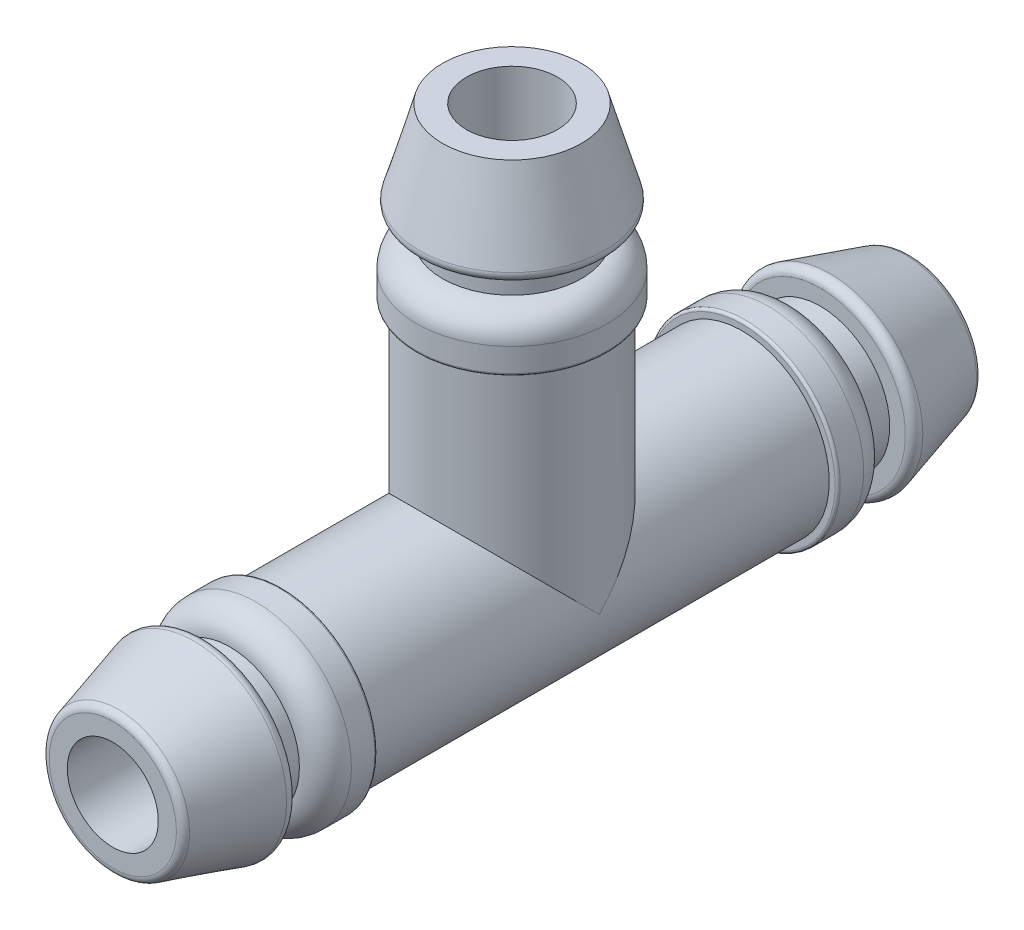
ISO-10303-21;
HEADER;
FILE_DESCRIPTION(('STEP AP214'),'2;1');
FILE_NAME('part.step','',(''),(''),'','','');
FILE_SCHEMA(('AUTOMOTIVE_DESIGN { 1 0 10303 214 1 1 1 1 }'));
ENDSEC;
DATA;
#1=APPLICATION_CONTEXT('core data for automotive mechanical design processes');
#2=APPLICATION_PROTOCOL_DEFINITION('international standard','automotive_design',2000,#1);
#3=PRODUCT_CONTEXT('',#1,'mechanical');
#4=PRODUCT('Part','Part','',(#3));
#5=PRODUCT_RELATED_PRODUCT_CATEGORY('part','',(#4));
#6=PRODUCT_DEFINITION_FORMATION('','',#4);
#7=PRODUCT_DEFINITION_CONTEXT('part definition',#1,'design');
#8=PRODUCT_DEFINITION('design','',#6,#7);
#9=PRODUCT_DEFINITION_SHAPE('','',#8);
#10=(LENGTH_UNIT() NAMED_UNIT(*) SI_UNIT(.MILLI.,.METRE.));
#11=(NAMED_UNIT(*) PLANE_ANGLE_UNIT() SI_UNIT($,.RADIAN.));
#12=(NAMED_UNIT(*) SI_UNIT($,.STERADIAN.) SOLID_ANGLE_UNIT());
#13=UNCERTAINTY_MEASURE_WITH_UNIT(LENGTH_MEASURE(1.E-05),#10,'distance_accuracy_value','');
#14=(GEOMETRIC_REPRESENTATION_CONTEXT(3) GLOBAL_UNCERTAINTY_ASSIGNED_CONTEXT((#13)) GLOBAL_UNIT_ASSIGNED_CONTEXT((#10,
#11,#12)) REPRESENTATION_CONTEXT('',''));
#15=CARTESIAN_POINT('',(0.,0.,0.));
#16=DIRECTION('',(0.,0.,1.));
#17=DIRECTION('',(1.,0.,0.));
#18=AXIS2_PLACEMENT_3D('',#15,#16,#17);
#19=CARTESIAN_POINT('',(0.,0.,-8.85));
#20=DIRECTION('',(0.,0.,1.));
#21=DIRECTION('',(1.,0.,0.));
#22=AXIS2_PLACEMENT_3D('',#19,#20,#21);
#23=CYLINDRICAL_SURFACE('',#22,3.35);
#24=CARTESIAN_POINT('',(0.,0.,-8.85));
#25=DIRECTION('',(0.,0.,1.));
#26=DIRECTION('',(1.,0.,0.));
#27=AXIS2_PLACEMENT_3D('',#24,#25,#26);
#28=CIRCLE('',#27,3.35);
#29=CARTESIAN_POINT('',(3.35,0.,-8.85));
#30=VERTEX_POINT('',#29);
#31=EDGE_CURVE('E104',#30,#30,#28,.T.);
#32=ORIENTED_EDGE('',*,*,#31,.T.);
#33=EDGE_LOOP('',(#32));
#34=FACE_BOUND('',#33,.T.);
#35=CARTESIAN_POINT('',(0.,0.,8.85));
#36=DIRECTION('',(0.,0.,1.));
#37=DIRECTION('',(1.,0.,0.));
#38=AXIS2_PLACEMENT_3D('',#35,#36,#37);
#39=CIRCLE('',#38,3.35);
#40=CARTESIAN_POINT('',(3.35,0.,8.85));
#41=VERTEX_POINT('',#40);
#42=EDGE_CURVE('E109',#41,#41,#39,.T.);
#43=ORIENTED_EDGE('',*,*,#42,.F.);
#44=EDGE_LOOP('',(#43));
#45=FACE_BOUND('',#44,.T.);
#46=CARTESIAN_POINT('',(0.,0.,0.));
#47=DIRECTION('',(0.,0.707106781186547,0.707106781186547));
#48=DIRECTION('',(0.,-0.707106781186547,0.707106781186547));
#49=AXIS2_PLACEMENT_3D('',#46,#47,#48);
#50=ELLIPSE('',#49,4.73761543394987,3.35);
#51=CARTESIAN_POINT('',(-3.35,0.,0.));
#52=VERTEX_POINT('',#51);
#53=CARTESIAN_POINT('',(3.35,0.,0.));
#54=VERTEX_POINT('',#53);
#55=EDGE_CURVE('E180',#52,#54,#50,.F.);
#56=ORIENTED_EDGE('',*,*,#55,.T.);
#57=CARTESIAN_POINT('',(0.,0.,0.));
#58=DIRECTION('',(0.,-0.707106781186547,0.707106781186547));
#59=DIRECTION('',(0.,0.707106781186547,0.707106781186547));
#60=AXIS2_PLACEMENT_3D('',#57,#58,#59);
#61=ELLIPSE('',#60,4.73761543394987,3.35);
#62=EDGE_CURVE('E61',#54,#52,#61,.T.);
#63=ORIENTED_EDGE('',*,*,#62,.T.);
#64=EDGE_LOOP('',(#56,#63));
#65=FACE_BOUND('',#64,.T.);
#66=ADVANCED_FACE('F39',(#34,#45,#65),#23,.T.);
#67=CARTESIAN_POINT('',(0.,0.,10.85));
#68=DIRECTION('',(0.,0.,-1.));
#69=DIRECTION('',(-1.,0.,0.));
#70=AXIS2_PLACEMENT_3D('',#67,#68,#69);
#71=CYLINDRICAL_SURFACE('',#70,3.675);
#72=CARTESIAN_POINT('',(0.,0.,8.95));
#73=DIRECTION('',(0.,0.,1.));
#74=DIRECTION('',(1.,0.,0.));
#75=AXIS2_PLACEMENT_3D('',#72,#73,#74);
#76=CIRCLE('',#75,3.675);
#77=CARTESIAN_POINT('',(3.675,0.,8.95));
#78=VERTEX_POINT('',#77);
#79=EDGE_CURVE('E140',#78,#78,#76,.T.);
#80=ORIENTED_EDGE('',*,*,#79,.T.);
#81=EDGE_LOOP('',(#80));
#82=FACE_BOUND('',#81,.T.);
#83=CARTESIAN_POINT('',(0.,0.,9.85));
#84=DIRECTION('',(0.,0.,1.));
#85=DIRECTION('',(1.,0.,0.));
#86=AXIS2_PLACEMENT_3D('',#83,#84,#85);
#87=CIRCLE('',#86,3.675);
#88=CARTESIAN_POINT('',(3.675,0.,9.85));
#89=VERTEX_POINT('',#88);
#90=EDGE_CURVE('E120',#89,#89,#87,.F.);
#91=ORIENTED_EDGE('',*,*,#90,.T.);
#92=EDGE_LOOP('',(#91));
#93=FACE_BOUND('',#92,.T.);
#94=ADVANCED_FACE('F216',(#82,#93),#71,.T.);
#95=CARTESIAN_POINT('',(0.,0.,8.85));
#96=DIRECTION('',(0.,0.,1.));
#97=DIRECTION('',(1.,0.,0.));
#98=AXIS2_PLACEMENT_3D('',#95,#96,#97);
#99=PLANE('',#98);
#100=CARTESIAN_POINT('',(0.,0.,8.85));
#101=DIRECTION('',(0.,0.,1.));
#102=DIRECTION('',(1.,0.,0.));
#103=AXIS2_PLACEMENT_3D('',#100,#101,#102);
#104=CIRCLE('',#103,3.575);
#105=CARTESIAN_POINT('',(3.575,0.,8.85));
#106=VERTEX_POINT('',#105);
#107=EDGE_CURVE('E144',#106,#106,#104,.F.);
#108=ORIENTED_EDGE('',*,*,#107,.T.);
#109=EDGE_LOOP('',(#108));
#110=FACE_BOUND('',#109,.T.);
#111=ORIENTED_EDGE('',*,*,#42,.T.);
#112=EDGE_LOOP('',(#111));
#113=FACE_BOUND('',#112,.T.);
#114=ADVANCED_FACE('F222',(#110,#113),#99,.F.);
#115=CARTESIAN_POINT('',(0.,0.,9.85));
#116=DIRECTION('',(0.,0.,1.));
#117=DIRECTION('',(1.,0.,0.));
#118=AXIS2_PLACEMENT_3D('',#115,#116,#117);
#119=TOROIDAL_SURFACE('',#118,2.675,1.);
#120=ORIENTED_EDGE('',*,*,#90,.F.);
#121=EDGE_LOOP('',(#120));
#122=FACE_BOUND('',#121,.T.);
#123=CARTESIAN_POINT('',(0.,0.,10.85));
#124=DIRECTION('',(0.,0.,1.));
#125=DIRECTION('',(1.,0.,0.));
#126=AXIS2_PLACEMENT_3D('',#123,#124,#125);
#127=CIRCLE('',#126,2.675);
#128=CARTESIAN_POINT('',(2.675,0.,10.85));
#129=VERTEX_POINT('',#128);
#130=EDGE_CURVE('E113',#129,#129,#127,.T.);
#131=ORIENTED_EDGE('',*,*,#130,.F.);
#132=EDGE_LOOP('',(#131));
#133=FACE_BOUND('',#132,.T.);
#134=ADVANCED_FACE('F228',(#122,#133),#119,.T.);
#135=CARTESIAN_POINT('',(0.,0.,11.85));
#136=DIRECTION('',(0.,0.,-1.));
#137=DIRECTION('',(-1.,0.,0.));
#138=AXIS2_PLACEMENT_3D('',#135,#136,#137);
#139=CYLINDRICAL_SURFACE('',#138,2.675);
#140=CARTESIAN_POINT('',(0.,0.,11.85));
#141=DIRECTION('',(0.,0.,1.));
#142=DIRECTION('',(1.,0.,0.));
#143=AXIS2_PLACEMENT_3D('',#140,#141,#142);
#144=CIRCLE('',#143,2.675);
#145=CARTESIAN_POINT('',(2.675,0.,11.85));
#146=VERTEX_POINT('',#145);
#147=EDGE_CURVE('E105',#146,#146,#144,.T.);
#148=ORIENTED_EDGE('',*,*,#147,.F.);
#149=EDGE_LOOP('',(#148));
#150=FACE_BOUND('',#149,.T.);
#151=ORIENTED_EDGE('',*,*,#130,.T.);
#152=EDGE_LOOP('',(#151));
#153=FACE_BOUND('',#152,.T.);
#154=ADVANCED_FACE('F231',(#150,#153),#139,.T.);
#155=CARTESIAN_POINT('',(0.,0.,11.85));
#156=DIRECTION('',(0.,0.,-1.));
#157=DIRECTION('',(1.,0.,0.));
#158=AXIS2_PLACEMENT_3D('',#155,#156,#157);
#159=CONICAL_SURFACE('',#158,3.675,0.279252680319093);
#160=CARTESIAN_POINT('',(0.,0.,12.2326912067451));
#161=DIRECTION('',(0.,0.,1.));
#162=DIRECTION('',(1.,0.,0.));
#163=AXIS2_PLACEMENT_3D('',#160,#161,#162);
#164=CIRCLE('',#163,3.56526506229537);
#165=CARTESIAN_POINT('',(3.56526506229537,0.,12.2326912067451));
#166=VERTEX_POINT('',#165);
#167=EDGE_CURVE('E128',#166,#166,#164,.T.);
#168=ORIENTED_EDGE('',*,*,#167,.T.);
#169=EDGE_LOOP('',(#168));
#170=FACE_BOUND('',#169,.T.);
#171=CARTESIAN_POINT('',(0.,0.,15.1326912067451));
#172=DIRECTION('',(0.,0.,-1.));
#173=DIRECTION('',(-1.,0.,0.));
#174=AXIS2_PLACEMENT_3D('',#171,#172,#173);
#175=CIRCLE('',#174,2.73370344359483);
#176=CARTESIAN_POINT('',(-2.73370344359483,0.,15.1326912067451));
#177=VERTEX_POINT('',#176);
#178=EDGE_CURVE('E124',#177,#177,#175,.T.);
#179=ORIENTED_EDGE('',*,*,#178,.T.);
#180=EDGE_LOOP('',(#179));
#181=FACE_BOUND('',#180,.T.);
#182=ADVANCED_FACE('F317',(#170,#181),#159,.T.);
#183=CARTESIAN_POINT('',(0.,0.,15.35));
#184=DIRECTION('',(0.,0.,1.));
#185=DIRECTION('',(1.,0.,0.));
#186=AXIS2_PLACEMENT_3D('',#183,#184,#185);
#187=PLANE('',#186);
#188=CARTESIAN_POINT('',(0.,0.,15.35));
#189=DIRECTION('',(0.,0.,-1.));
#190=DIRECTION('',(-1.,0.,0.));
#191=AXIS2_PLACEMENT_3D('',#188,#189,#190);
#192=CIRCLE('',#191,1.75);
#193=CARTESIAN_POINT('',(-1.75,0.,15.35));
#194=VERTEX_POINT('',#193);
#195=EDGE_CURVE('E89',#194,#194,#192,.T.);
#196=ORIENTED_EDGE('',*,*,#195,.T.);
#197=EDGE_LOOP('',(#196));
#198=FACE_BOUND('',#197,.T.);
#199=CARTESIAN_POINT('',(0.,0.,15.35));
#200=DIRECTION('',(0.,0.,1.));
#201=DIRECTION('',(1.,0.,0.));
#202=AXIS2_PLACEMENT_3D('',#199,#200,#201);
#203=CIRCLE('',#202,2.44532493481333);
#204=CARTESIAN_POINT('',(2.44532493481333,0.,15.35));
#205=VERTEX_POINT('',#204);
#206=EDGE_CURVE('E136',#205,#205,#203,.T.);
#207=ORIENTED_EDGE('',*,*,#206,.T.);
#208=EDGE_LOOP('',(#207));
#209=FACE_BOUND('',#208,.T.);
#210=ADVANCED_FACE('F314',(#198,#209),#187,.T.);
#211=CARTESIAN_POINT('',(0.,0.,11.85));
#212=DIRECTION('',(0.,0.,1.));
#213=DIRECTION('',(1.,0.,0.));
#214=AXIS2_PLACEMENT_3D('',#211,#212,#213);
#215=PLANE('',#214);
#216=CARTESIAN_POINT('',(0.,0.,11.85));
#217=DIRECTION('',(0.,0.,1.));
#218=DIRECTION('',(1.,0.,0.));
#219=AXIS2_PLACEMENT_3D('',#216,#217,#218);
#220=CIRCLE('',#219,3.27688655351388);
#221=CARTESIAN_POINT('',(3.27688655351388,0.,11.85));
#222=VERTEX_POINT('',#221);
#223=EDGE_CURVE('E132',#222,#222,#220,.F.);
#224=ORIENTED_EDGE('',*,*,#223,.T.);
#225=EDGE_LOOP('',(#224));
#226=FACE_BOUND('',#225,.T.);
#227=ORIENTED_EDGE('',*,*,#147,.T.);
#228=EDGE_LOOP('',(#227));
#229=FACE_BOUND('',#228,.T.);
#230=ADVANCED_FACE('F237',(#226,#229),#215,.F.);
#231=CARTESIAN_POINT('',(0.,0.,12.15));
#232=DIRECTION('',(0.,0.,1.));
#233=DIRECTION('',(1.,0.,0.));
#234=AXIS2_PLACEMENT_3D('',#231,#232,#233);
#235=TOROIDAL_SURFACE('',#234,3.27688655351388,0.3);
#236=ORIENTED_EDGE('',*,*,#223,.F.);
#237=EDGE_LOOP('',(#236));
#238=FACE_BOUND('',#237,.T.);
#239=ORIENTED_EDGE('',*,*,#167,.F.);
#240=EDGE_LOOP('',(#239));
#241=FACE_BOUND('',#240,.T.);
#242=ADVANCED_FACE('F233',(#238,#241),#235,.T.);
#243=CARTESIAN_POINT('',(0.,0.,15.05));
#244=DIRECTION('',(0.,0.,1.));
#245=DIRECTION('',(1.,0.,0.));
#246=AXIS2_PLACEMENT_3D('',#243,#244,#245);
#247=TOROIDAL_SURFACE('',#246,2.44532493481333,0.3);
#248=ORIENTED_EDGE('',*,*,#178,.F.);
#249=EDGE_LOOP('',(#248));
#250=FACE_BOUND('',#249,.T.);
#251=ORIENTED_EDGE('',*,*,#206,.F.);
#252=EDGE_LOOP('',(#251));
#253=FACE_BOUND('',#252,.T.);
#254=ADVANCED_FACE('F236',(#250,#253),#247,.T.);
#255=CARTESIAN_POINT('',(0.,0.,8.95));
#256=DIRECTION('',(0.,0.,1.));
#257=DIRECTION('',(1.,0.,0.));
#258=AXIS2_PLACEMENT_3D('',#255,#256,#257);
#259=TOROIDAL_SURFACE('',#258,3.575,0.1);
#260=ORIENTED_EDGE('',*,*,#107,.F.);
#261=EDGE_LOOP('',(#260));
#262=FACE_BOUND('',#261,.T.);
#263=ORIENTED_EDGE('',*,*,#79,.F.);
#264=EDGE_LOOP('',(#263));
#265=FACE_BOUND('',#264,.T.);
#266=ADVANCED_FACE('F241',(#262,#265),#259,.T.);
#267=CARTESIAN_POINT('',(0.,0.,-10.85));
#268=DIRECTION('',(0.,0.,1.));
#269=DIRECTION('',(1.,0.,0.));
#270=AXIS2_PLACEMENT_3D('',#267,#268,#269);
#271=CYLINDRICAL_SURFACE('',#270,3.675);
#272=CARTESIAN_POINT('',(0.,0.,-8.95));
#273=DIRECTION('',(0.,0.,-1.));
#274=DIRECTION('',(-1.,0.,0.));
#275=AXIS2_PLACEMENT_3D('',#272,#273,#274);
#276=CIRCLE('',#275,3.675);
#277=CARTESIAN_POINT('',(-3.675,0.,-8.95));
#278=VERTEX_POINT('',#277);
#279=EDGE_CURVE('E176',#278,#278,#276,.T.);
#280=ORIENTED_EDGE('',*,*,#279,.T.);
#281=EDGE_LOOP('',(#280));
#282=FACE_BOUND('',#281,.T.);
#283=CARTESIAN_POINT('',(0.,0.,-9.85));
#284=DIRECTION('',(0.,0.,-1.));
#285=DIRECTION('',(-1.,0.,0.));
#286=AXIS2_PLACEMENT_3D('',#283,#284,#285);
#287=CIRCLE('',#286,3.675);
#288=CARTESIAN_POINT('',(-3.675,0.,-9.85));
#289=VERTEX_POINT('',#288);
#290=EDGE_CURVE('E148',#289,#289,#287,.F.);
#291=ORIENTED_EDGE('',*,*,#290,.T.);
#292=EDGE_LOOP('',(#291));
#293=FACE_BOUND('',#292,.T.);
#294=ADVANCED_FACE('F245',(#282,#293),#271,.T.);
#295=CARTESIAN_POINT('',(0.,0.,-8.85));
#296=DIRECTION('',(0.,0.,-1.));
#297=DIRECTION('',(1.,0.,0.));
#298=AXIS2_PLACEMENT_3D('',#295,#296,#297);
#299=PLANE('',#298);
#300=CARTESIAN_POINT('',(0.,0.,-8.85));
#301=DIRECTION('',(0.,0.,-1.));
#302=DIRECTION('',(-1.,0.,0.));
#303=AXIS2_PLACEMENT_3D('',#300,#301,#302);
#304=CIRCLE('',#303,3.575);
#305=CARTESIAN_POINT('',(-3.575,0.,-8.85));
#306=VERTEX_POINT('',#305);
#307=EDGE_CURVE('E172',#306,#306,#304,.F.);
#308=ORIENTED_EDGE('',*,*,#307,.T.);
#309=EDGE_LOOP('',(#308));
#310=FACE_BOUND('',#309,.T.);
#311=ORIENTED_EDGE('',*,*,#31,.F.);
#312=EDGE_LOOP('',(#311));
#313=FACE_BOUND('',#312,.T.);
#314=ADVANCED_FACE('F251',(#310,#313),#299,.F.);
#315=CARTESIAN_POINT('',(0.,0.,-9.85));
#316=DIRECTION('',(0.,0.,-1.));
#317=DIRECTION('',(-1.,0.,0.));
#318=AXIS2_PLACEMENT_3D('',#315,#316,#317);
#319=TOROIDAL_SURFACE('',#318,2.675,1.);
#320=CARTESIAN_POINT('',(0.,0.,-10.85));
#321=DIRECTION('',(0.,0.,-1.));
#322=DIRECTION('',(-1.,0.,0.));
#323=AXIS2_PLACEMENT_3D('',#320,#321,#322);
#324=CIRCLE('',#323,2.675);
#325=CARTESIAN_POINT('',(-2.675,0.,-10.85));
#326=VERTEX_POINT('',#325);
#327=EDGE_CURVE('E152',#326,#326,#324,.T.);
#328=ORIENTED_EDGE('',*,*,#327,.F.);
#329=EDGE_LOOP('',(#328));
#330=FACE_BOUND('',#329,.T.);
#331=ORIENTED_EDGE('',*,*,#290,.F.);
#332=EDGE_LOOP('',(#331));
#333=FACE_BOUND('',#332,.T.);
#334=ADVANCED_FACE('F247',(#330,#333),#319,.T.);
#335=CARTESIAN_POINT('',(0.,0.,-11.85));
#336=DIRECTION('',(0.,0.,1.));
#337=DIRECTION('',(1.,0.,0.));
#338=AXIS2_PLACEMENT_3D('',#335,#336,#337);
#339=CYLINDRICAL_SURFACE('',#338,2.675);
#340=CARTESIAN_POINT('',(0.,0.,-11.85));
#341=DIRECTION('',(0.,0.,1.));
#342=DIRECTION('',(1.,0.,0.));
#343=AXIS2_PLACEMENT_3D('',#340,#341,#342);
#344=CIRCLE('',#343,2.675);
#345=CARTESIAN_POINT('',(2.675,0.,-11.85));
#346=VERTEX_POINT('',#345);
#347=EDGE_CURVE('E100',#346,#346,#344,.T.);
#348=ORIENTED_EDGE('',*,*,#347,.T.);
#349=EDGE_LOOP('',(#348));
#350=FACE_BOUND('',#349,.T.);
#351=ORIENTED_EDGE('',*,*,#327,.T.);
#352=EDGE_LOOP('',(#351));
#353=FACE_BOUND('',#352,.T.);
#354=ADVANCED_FACE('F250',(#350,#353),#339,.T.);
#355=CARTESIAN_POINT('',(0.,0.,-11.85));
#356=DIRECTION('',(0.,0.,1.));
#357=DIRECTION('',(1.,0.,0.));
#358=AXIS2_PLACEMENT_3D('',#355,#356,#357);
#359=CONICAL_SURFACE('',#358,3.675,0.279252680319093);
#360=CARTESIAN_POINT('',(0.,0.,-12.2326912067451));
#361=DIRECTION('',(0.,0.,1.));
#362=DIRECTION('',(1.,0.,0.));
#363=AXIS2_PLACEMENT_3D('',#360,#361,#362);
#364=CIRCLE('',#363,3.56526506229537);
#365=CARTESIAN_POINT('',(3.56526506229537,0.,-12.2326912067451));
#366=VERTEX_POINT('',#365);
#367=EDGE_CURVE('E164',#366,#366,#364,.F.);
#368=ORIENTED_EDGE('',*,*,#367,.T.);
#369=EDGE_LOOP('',(#368));
#370=FACE_BOUND('',#369,.T.);
#371=CARTESIAN_POINT('',(0.,0.,-15.1326912067451));
#372=DIRECTION('',(0.,0.,-1.));
#373=DIRECTION('',(-1.,0.,0.));
#374=AXIS2_PLACEMENT_3D('',#371,#372,#373);
#375=CIRCLE('',#374,2.73370344359483);
#376=CARTESIAN_POINT('',(-2.73370344359483,0.,-15.1326912067451));
#377=VERTEX_POINT('',#376);
#378=EDGE_CURVE('E160',#377,#377,#375,.F.);
#379=ORIENTED_EDGE('',*,*,#378,.T.);
#380=EDGE_LOOP('',(#379));
#381=FACE_BOUND('',#380,.T.);
#382=ADVANCED_FACE('F297',(#370,#381),#359,.T.);
#383=CARTESIAN_POINT('',(0.,0.,-15.35));
#384=DIRECTION('',(0.,0.,-1.));
#385=DIRECTION('',(1.,0.,0.));
#386=AXIS2_PLACEMENT_3D('',#383,#384,#385);
#387=PLANE('',#386);
#388=CARTESIAN_POINT('',(0.,0.,-15.35));
#389=DIRECTION('',(0.,0.,-1.));
#390=DIRECTION('',(-1.,0.,0.));
#391=AXIS2_PLACEMENT_3D('',#388,#389,#390);
#392=CIRCLE('',#391,1.75);
#393=CARTESIAN_POINT('',(-1.75,0.,-15.35));
#394=VERTEX_POINT('',#393);
#395=EDGE_CURVE('E88',#394,#394,#392,.T.);
#396=ORIENTED_EDGE('',*,*,#395,.F.);
#397=EDGE_LOOP('',(#396));
#398=FACE_BOUND('',#397,.T.);
#399=CARTESIAN_POINT('',(0.,0.,-15.35));
#400=DIRECTION('',(0.,0.,-1.));
#401=DIRECTION('',(-1.,0.,0.));
#402=AXIS2_PLACEMENT_3D('',#399,#400,#401);
#403=CIRCLE('',#402,2.44532493481333);
#404=CARTESIAN_POINT('',(-2.44532493481333,0.,-15.35));
#405=VERTEX_POINT('',#404);
#406=EDGE_CURVE('E168',#405,#405,#403,.T.);
#407=ORIENTED_EDGE('',*,*,#406,.T.);
#408=EDGE_LOOP('',(#407));
#409=FACE_BOUND('',#408,.T.);
#410=ADVANCED_FACE('F294',(#398,#409),#387,.T.);
#411=CARTESIAN_POINT('',(0.,0.,-11.85));
#412=DIRECTION('',(0.,0.,-1.));
#413=DIRECTION('',(1.,0.,0.));
#414=AXIS2_PLACEMENT_3D('',#411,#412,#413);
#415=PLANE('',#414);
#416=CARTESIAN_POINT('',(0.,0.,-11.85));
#417=DIRECTION('',(0.,0.,-1.));
#418=DIRECTION('',(-1.,0.,0.));
#419=AXIS2_PLACEMENT_3D('',#416,#417,#418);
#420=CIRCLE('',#419,3.27688655351388);
#421=CARTESIAN_POINT('',(-3.27688655351388,0.,-11.85));
#422=VERTEX_POINT('',#421);
#423=EDGE_CURVE('E156',#422,#422,#420,.F.);
#424=ORIENTED_EDGE('',*,*,#423,.T.);
#425=EDGE_LOOP('',(#424));
#426=FACE_BOUND('',#425,.T.);
#427=ORIENTED_EDGE('',*,*,#347,.F.);
#428=EDGE_LOOP('',(#427));
#429=FACE_BOUND('',#428,.T.);
#430=ADVANCED_FACE('F257',(#426,#429),#415,.F.);
#431=CARTESIAN_POINT('',(0.,0.,-12.15));
#432=DIRECTION('',(0.,0.,-1.));
#433=DIRECTION('',(-1.,0.,0.));
#434=AXIS2_PLACEMENT_3D('',#431,#432,#433);
#435=TOROIDAL_SURFACE('',#434,3.27688655351388,0.3);
#436=ORIENTED_EDGE('',*,*,#367,.F.);
#437=EDGE_LOOP('',(#436));
#438=FACE_BOUND('',#437,.T.);
#439=ORIENTED_EDGE('',*,*,#423,.F.);
#440=EDGE_LOOP('',(#439));
#441=FACE_BOUND('',#440,.T.);
#442=ADVANCED_FACE('F253',(#438,#441),#435,.T.);
#443=CARTESIAN_POINT('',(0.,0.,-15.05));
#444=DIRECTION('',(0.,0.,-1.));
#445=DIRECTION('',(-1.,0.,0.));
#446=AXIS2_PLACEMENT_3D('',#443,#444,#445);
#447=TOROIDAL_SURFACE('',#446,2.44532493481333,0.3);
#448=ORIENTED_EDGE('',*,*,#406,.F.);
#449=EDGE_LOOP('',(#448));
#450=FACE_BOUND('',#449,.T.);
#451=ORIENTED_EDGE('',*,*,#378,.F.);
#452=EDGE_LOOP('',(#451));
#453=FACE_BOUND('',#452,.T.);
#454=ADVANCED_FACE('F256',(#450,#453),#447,.T.);
#455=CARTESIAN_POINT('',(0.,0.,-8.95));
#456=DIRECTION('',(0.,0.,-1.));
#457=DIRECTION('',(-1.,0.,0.));
#458=AXIS2_PLACEMENT_3D('',#455,#456,#457);
#459=TOROIDAL_SURFACE('',#458,3.575,0.1);
#460=ORIENTED_EDGE('',*,*,#279,.F.);
#461=EDGE_LOOP('',(#460));
#462=FACE_BOUND('',#461,.T.);
#463=ORIENTED_EDGE('',*,*,#307,.F.);
#464=EDGE_LOOP('',(#463));
#465=FACE_BOUND('',#464,.T.);
#466=ADVANCED_FACE('F261',(#462,#465),#459,.T.);
#467=CARTESIAN_POINT('',(0.,8.85,0.));
#468=DIRECTION('',(0.,-1.,0.));
#469=DIRECTION('',(0.,0.,-1.));
#470=AXIS2_PLACEMENT_3D('',#467,#468,#469);
#471=CYLINDRICAL_SURFACE('',#470,3.35);
#472=ORIENTED_EDGE('',*,*,#62,.F.);
#473=ORIENTED_EDGE('',*,*,#55,.F.);
#474=EDGE_LOOP('',(#472,#473));
#475=FACE_BOUND('',#474,.T.);
#476=CARTESIAN_POINT('',(0.,8.85,0.));
#477=DIRECTION('',(0.,1.,0.));
#478=DIRECTION('',(0.,0.,1.));
#479=AXIS2_PLACEMENT_3D('',#476,#477,#478);
#480=CIRCLE('',#479,3.35);
#481=CARTESIAN_POINT('',(0.,8.85,3.35));
#482=VERTEX_POINT('',#481);
#483=EDGE_CURVE('E93',#482,#482,#480,.T.);
#484=ORIENTED_EDGE('',*,*,#483,.F.);
#485=EDGE_LOOP('',(#484));
#486=FACE_BOUND('',#485,.T.);
#487=ADVANCED_FACE('F265',(#475,#486),#471,.T.);
#488=CARTESIAN_POINT('',(0.,0.,15.35));
#489=DIRECTION('',(0.,0.,-1.));
#490=DIRECTION('',(-1.,0.,0.));
#491=AXIS2_PLACEMENT_3D('',#488,#489,#490);
#492=CYLINDRICAL_SURFACE('',#491,1.75);
#493=CARTESIAN_POINT('',(0.,0.,0.));
#494=DIRECTION('',(0.,0.707106781186547,0.707106781186547));
#495=DIRECTION('',(0.,0.707106781186547,-0.707106781186547));
#496=AXIS2_PLACEMENT_3D('',#493,#494,#495);
#497=ELLIPSE('',#496,2.47487373415292,1.75);
#498=CARTESIAN_POINT('',(-1.75,0.,0.));
#499=VERTEX_POINT('',#498);
#500=CARTESIAN_POINT('',(1.75,0.,0.));
#501=VERTEX_POINT('',#500);
#502=EDGE_CURVE('E66',#499,#501,#497,.F.);
#503=ORIENTED_EDGE('',*,*,#502,.F.);
#504=CARTESIAN_POINT('',(0.,0.,0.));
#505=DIRECTION('',(0.,0.707106781186547,-0.707106781186547));
#506=DIRECTION('',(0.,0.707106781186547,0.707106781186547));
#507=AXIS2_PLACEMENT_3D('',#504,#505,#506);
#508=ELLIPSE('',#507,2.47487373415292,1.75);
#509=EDGE_CURVE('E54',#501,#499,#508,.F.);
#510=ORIENTED_EDGE('',*,*,#509,.F.);
#511=EDGE_LOOP('',(#503,#510));
#512=FACE_BOUND('',#511,.T.);
#513=ORIENTED_EDGE('',*,*,#195,.F.);
#514=EDGE_LOOP('',(#513));
#515=FACE_BOUND('',#514,.T.);
#516=ORIENTED_EDGE('',*,*,#395,.T.);
#517=EDGE_LOOP('',(#516));
#518=FACE_BOUND('',#517,.T.);
#519=ADVANCED_FACE('F71',(#512,#515,#518),#492,.F.);
#520=CARTESIAN_POINT('',(0.,10.85,0.));
#521=DIRECTION('',(0.,-1.,0.));
#522=DIRECTION('',(0.,0.,-1.));
#523=AXIS2_PLACEMENT_3D('',#520,#521,#522);
#524=CYLINDRICAL_SURFACE('',#523,3.675);
#525=CARTESIAN_POINT('',(0.,8.95,0.));
#526=DIRECTION('',(0.,1.,0.));
#527=DIRECTION('',(0.,0.,1.));
#528=AXIS2_PLACEMENT_3D('',#525,#526,#527);
#529=CIRCLE('',#528,3.675);
#530=CARTESIAN_POINT('',(0.,8.95,3.675));
#531=VERTEX_POINT('',#530);
#532=EDGE_CURVE('E48',#531,#531,#529,.T.);
#533=ORIENTED_EDGE('',*,*,#532,.T.);
#534=EDGE_LOOP('',(#533));
#535=FACE_BOUND('',#534,.T.);
#536=CARTESIAN_POINT('',(0.,9.85,0.));
#537=DIRECTION('',(0.,1.,0.));
#538=DIRECTION('',(0.,0.,1.));
#539=AXIS2_PLACEMENT_3D('',#536,#537,#538);
#540=CIRCLE('',#539,3.675);
#541=CARTESIAN_POINT('',(0.,9.85,3.675));
#542=VERTEX_POINT('',#541);
#543=EDGE_CURVE('E189',#542,#542,#540,.F.);
#544=ORIENTED_EDGE('',*,*,#543,.T.);
#545=EDGE_LOOP('',(#544));
#546=FACE_BOUND('',#545,.T.);
#547=ADVANCED_FACE('F204',(#535,#546),#524,.T.);
#548=CARTESIAN_POINT('',(0.,8.85,0.));
#549=DIRECTION('',(0.,1.,0.));
#550=DIRECTION('',(0.,0.,1.));
#551=AXIS2_PLACEMENT_3D('',#548,#549,#550);
#552=PLANE('',#551);
#553=CARTESIAN_POINT('',(0.,8.85,0.));
#554=DIRECTION('',(0.,1.,0.));
#555=DIRECTION('',(0.,0.,1.));
#556=AXIS2_PLACEMENT_3D('',#553,#554,#555);
#557=CIRCLE('',#556,3.575);
#558=CARTESIAN_POINT('',(0.,8.85,3.575));
#559=VERTEX_POINT('',#558);
#560=EDGE_CURVE('E11',#559,#559,#557,.F.);
#561=ORIENTED_EDGE('',*,*,#560,.T.);
#562=EDGE_LOOP('',(#561));
#563=FACE_BOUND('',#562,.T.);
#564=ORIENTED_EDGE('',*,*,#483,.T.);
#565=EDGE_LOOP('',(#564));
#566=FACE_BOUND('',#565,.T.);
#567=ADVANCED_FACE('F270',(#563,#566),#552,.F.);
#568=CARTESIAN_POINT('',(0.,9.85,0.));
#569=DIRECTION('',(0.,1.,0.));
#570=DIRECTION('',(0.,0.,1.));
#571=AXIS2_PLACEMENT_3D('',#568,#569,#570);
#572=TOROIDAL_SURFACE('',#571,2.675,1.);
#573=ORIENTED_EDGE('',*,*,#543,.F.);
#574=EDGE_LOOP('',(#573));
#575=FACE_BOUND('',#574,.T.);
#576=CARTESIAN_POINT('',(0.,10.85,0.));
#577=DIRECTION('',(0.,1.,0.));
#578=DIRECTION('',(0.,0.,1.));
#579=AXIS2_PLACEMENT_3D('',#576,#577,#578);
#580=CIRCLE('',#579,2.675);
#581=CARTESIAN_POINT('',(0.,10.85,2.675));
#582=VERTEX_POINT('',#581);
#583=EDGE_CURVE('E185',#582,#582,#580,.T.);
#584=ORIENTED_EDGE('',*,*,#583,.F.);
#585=EDGE_LOOP('',(#584));
#586=FACE_BOUND('',#585,.T.);
#587=ADVANCED_FACE('F267',(#575,#586),#572,.T.);
#588=CARTESIAN_POINT('',(0.,11.85,0.));
#589=DIRECTION('',(0.,-1.,0.));
#590=DIRECTION('',(0.,0.,-1.));
#591=AXIS2_PLACEMENT_3D('',#588,#589,#590);
#592=CYLINDRICAL_SURFACE('',#591,2.675);
#593=CARTESIAN_POINT('',(0.,11.85,0.));
#594=DIRECTION('',(0.,1.,0.));
#595=DIRECTION('',(0.,0.,1.));
#596=AXIS2_PLACEMENT_3D('',#593,#594,#595);
#597=CIRCLE('',#596,2.675);
#598=CARTESIAN_POINT('',(0.,11.85,2.675));
#599=VERTEX_POINT('',#598);
#600=EDGE_CURVE('E84',#599,#599,#597,.T.);
#601=ORIENTED_EDGE('',*,*,#600,.F.);
#602=EDGE_LOOP('',(#601));
#603=FACE_BOUND('',#602,.T.);
#604=ORIENTED_EDGE('',*,*,#583,.T.);
#605=EDGE_LOOP('',(#604));
#606=FACE_BOUND('',#605,.T.);
#607=ADVANCED_FACE('F269',(#603,#606),#592,.T.);
#608=CARTESIAN_POINT('',(0.,11.85,0.));
#609=DIRECTION('',(0.,-1.,0.));
#610=DIRECTION('',(0.,0.,1.));
#611=AXIS2_PLACEMENT_3D('',#608,#609,#610);
#612=CONICAL_SURFACE('',#611,3.675,0.279252680319093);
#613=CARTESIAN_POINT('',(0.,12.2326912067451,0.));
#614=DIRECTION('',(0.,1.,0.));
#615=DIRECTION('',(0.,0.,1.));
#616=AXIS2_PLACEMENT_3D('',#613,#614,#615);
#617=CIRCLE('',#616,3.56526506229537);
#618=CARTESIAN_POINT('',(0.,12.2326912067451,3.56526506229537));
#619=VERTEX_POINT('',#618);
#620=EDGE_CURVE('E193',#619,#619,#617,.T.);
#621=ORIENTED_EDGE('',*,*,#620,.T.);
#622=EDGE_LOOP('',(#621));
#623=FACE_BOUND('',#622,.T.);
#624=CARTESIAN_POINT('',(0.,15.35,0.));
#625=DIRECTION('',(0.,1.,0.));
#626=DIRECTION('',(0.,0.,1.));
#627=AXIS2_PLACEMENT_3D('',#624,#625,#626);
#628=CIRCLE('',#627,2.67139114984417);
#629=CARTESIAN_POINT('',(0.,15.35,2.67139114984417));
#630=VERTEX_POINT('',#629);
#631=EDGE_CURVE('E78',#630,#630,#628,.T.);
#632=ORIENTED_EDGE('',*,*,#631,.F.);
#633=EDGE_LOOP('',(#632));
#634=FACE_BOUND('',#633,.T.);
#635=ADVANCED_FACE('F276',(#623,#634),#612,.T.);
#636=CARTESIAN_POINT('',(0.,15.35,0.));
#637=DIRECTION('',(0.,1.,0.));
#638=DIRECTION('',(0.,0.,1.));
#639=AXIS2_PLACEMENT_3D('',#636,#637,#638);
#640=PLANE('',#639);
#641=CARTESIAN_POINT('',(0.,15.35,0.));
#642=DIRECTION('',(0.,1.,0.));
#643=DIRECTION('',(0.,0.,1.));
#644=AXIS2_PLACEMENT_3D('',#641,#642,#643);
#645=CIRCLE('',#644,1.75);
#646=CARTESIAN_POINT('',(0.,15.35,1.75));
#647=VERTEX_POINT('',#646);
#648=EDGE_CURVE('E74',#647,#647,#645,.T.);
#649=ORIENTED_EDGE('',*,*,#648,.F.);
#650=EDGE_LOOP('',(#649));
#651=FACE_BOUND('',#650,.T.);
#652=ORIENTED_EDGE('',*,*,#631,.T.);
#653=EDGE_LOOP('',(#652));
#654=FACE_BOUND('',#653,.T.);
#655=ADVANCED_FACE('F436',(#651,#654),#640,.T.);
#656=CARTESIAN_POINT('',(0.,11.85,0.));
#657=DIRECTION('',(0.,1.,0.));
#658=DIRECTION('',(0.,0.,1.));
#659=AXIS2_PLACEMENT_3D('',#656,#657,#658);
#660=PLANE('',#659);
#661=CARTESIAN_POINT('',(0.,11.85,0.));
#662=DIRECTION('',(0.,1.,0.));
#663=DIRECTION('',(0.,0.,1.));
#664=AXIS2_PLACEMENT_3D('',#661,#662,#663);
#665=CIRCLE('',#664,3.27688655351388);
#666=CARTESIAN_POINT('',(0.,11.85,3.27688655351388));
#667=VERTEX_POINT('',#666);
#668=EDGE_CURVE('E197',#667,#667,#665,.F.);
#669=ORIENTED_EDGE('',*,*,#668,.T.);
#670=EDGE_LOOP('',(#669));
#671=FACE_BOUND('',#670,.T.);
#672=ORIENTED_EDGE('',*,*,#600,.T.);
#673=EDGE_LOOP('',(#672));
#674=FACE_BOUND('',#673,.T.);
#675=ADVANCED_FACE('F441',(#671,#674),#660,.F.);
#676=CARTESIAN_POINT('',(0.,-3.676,0.));
#677=DIRECTION('',(0.,1.,0.));
#678=DIRECTION('',(0.,0.,1.));
#679=AXIS2_PLACEMENT_3D('',#676,#677,#678);
#680=CYLINDRICAL_SURFACE('',#679,1.75);
#681=ORIENTED_EDGE('',*,*,#648,.T.);
#682=EDGE_LOOP('',(#681));
#683=FACE_BOUND('',#682,.T.);
#684=ORIENTED_EDGE('',*,*,#509,.T.);
#685=ORIENTED_EDGE('',*,*,#502,.T.);
#686=EDGE_LOOP('',(#684,#685));
#687=FACE_BOUND('',#686,.T.);
#688=ADVANCED_FACE('F67',(#683,#687),#680,.F.);
#689=CARTESIAN_POINT('',(0.,12.15,0.));
#690=DIRECTION('',(0.,1.,0.));
#691=DIRECTION('',(0.,0.,1.));
#692=AXIS2_PLACEMENT_3D('',#689,#690,#691);
#693=TOROIDAL_SURFACE('',#692,3.27688655351388,0.3);
#694=ORIENTED_EDGE('',*,*,#668,.F.);
#695=EDGE_LOOP('',(#694));
#696=FACE_BOUND('',#695,.T.);
#697=ORIENTED_EDGE('',*,*,#620,.F.);
#698=EDGE_LOOP('',(#697));
#699=FACE_BOUND('',#698,.T.);
#700=ADVANCED_FACE('F208',(#696,#699),#693,.T.);
#701=CARTESIAN_POINT('',(0.,8.95,0.));
#702=DIRECTION('',(0.,1.,0.));
#703=DIRECTION('',(0.,0.,1.));
#704=AXIS2_PLACEMENT_3D('',#701,#702,#703);
#705=TOROIDAL_SURFACE('',#704,3.575,0.1);
#706=ORIENTED_EDGE('',*,*,#560,.F.);
#707=EDGE_LOOP('',(#706));
#708=FACE_BOUND('',#707,.T.);
#709=ORIENTED_EDGE('',*,*,#532,.F.);
#710=EDGE_LOOP('',(#709));
#711=FACE_BOUND('',#710,.T.);
#712=ADVANCED_FACE('F41',(#708,#711),#705,.T.);
#713=CLOSED_SHELL('',(#66,#94,#114,#134,#154,#182,#210,#230,#242,#254,#266,#294,#314,#334,#354,
#382,#410,#430,#442,#454,#466,#487,#519,#547,#567,#587,#607,#635,#655,#675,#688,#700,#712));
#714=MANIFOLD_SOLID_BREP('B2',#713);
#715=ADVANCED_BREP_SHAPE_REPRESENTATION('',(#18,#714),#14);
#716=SHAPE_DEFINITION_REPRESENTATION(#9,#715);
ENDSEC;
END-ISO-10303-21;
